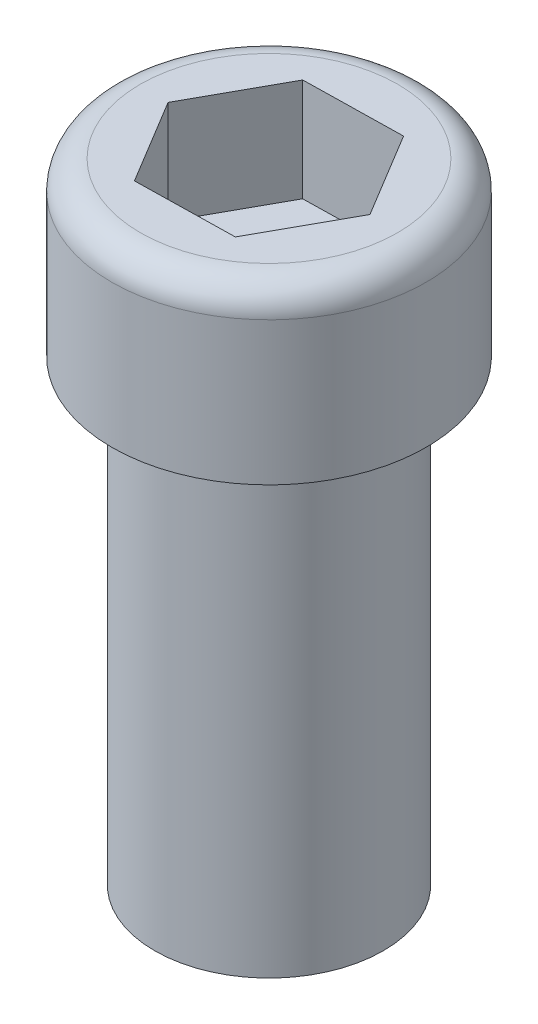
ISO-10303-21;
HEADER;
FILE_DESCRIPTION(('STEP AP214'),'2;1');
FILE_NAME('part.step','',(''),(''),'','','');
FILE_SCHEMA(('AUTOMOTIVE_DESIGN { 1 0 10303 214 1 1 1 1 }'));
ENDSEC;
DATA;
#1=APPLICATION_CONTEXT('core data for automotive mechanical design processes');
#2=APPLICATION_PROTOCOL_DEFINITION('international standard','automotive_design',2000,#1);
#3=PRODUCT_CONTEXT('',#1,'mechanical');
#4=PRODUCT('Part','Part','',(#3));
#5=PRODUCT_RELATED_PRODUCT_CATEGORY('part','',(#4));
#6=PRODUCT_DEFINITION_FORMATION('','',#4);
#7=PRODUCT_DEFINITION_CONTEXT('part definition',#1,'design');
#8=PRODUCT_DEFINITION('design','',#6,#7);
#9=PRODUCT_DEFINITION_SHAPE('','',#8);
#10=(LENGTH_UNIT() NAMED_UNIT(*) SI_UNIT(.MILLI.,.METRE.));
#11=(NAMED_UNIT(*) PLANE_ANGLE_UNIT() SI_UNIT($,.RADIAN.));
#12=(NAMED_UNIT(*) SI_UNIT($,.STERADIAN.) SOLID_ANGLE_UNIT());
#13=UNCERTAINTY_MEASURE_WITH_UNIT(LENGTH_MEASURE(1.E-05),#10,'distance_accuracy_value','');
#14=(GEOMETRIC_REPRESENTATION_CONTEXT(3) GLOBAL_UNCERTAINTY_ASSIGNED_CONTEXT((#13)) GLOBAL_UNIT_ASSIGNED_CONTEXT((#10,
#11,#12)) REPRESENTATION_CONTEXT('',''));
#15=CARTESIAN_POINT('',(0.,0.,0.));
#16=DIRECTION('',(0.,0.,1.));
#17=DIRECTION('',(1.,0.,0.));
#18=AXIS2_PLACEMENT_3D('',#15,#16,#17);
#19=CARTESIAN_POINT('',(0.,8.,0.));
#20=DIRECTION('',(0.,-1.,0.));
#21=DIRECTION('',(0.,0.,-1.));
#22=AXIS2_PLACEMENT_3D('',#19,#20,#21);
#23=CYLINDRICAL_SURFACE('',#22,2.);
#24=CARTESIAN_POINT('',(0.,8.,0.));
#25=DIRECTION('',(0.,1.,0.));
#26=DIRECTION('',(0.,0.,1.));
#27=AXIS2_PLACEMENT_3D('',#24,#25,#26);
#28=CIRCLE('',#27,2.);
#29=CARTESIAN_POINT('',(0.,8.,2.));
#30=VERTEX_POINT('',#29);
#31=EDGE_CURVE('E144',#30,#30,#28,.T.);
#32=ORIENTED_EDGE('',*,*,#31,.F.);
#33=EDGE_LOOP('',(#32));
#34=FACE_BOUND('',#33,.T.);
#35=CARTESIAN_POINT('',(0.,0.,0.));
#36=DIRECTION('',(0.,1.,0.));
#37=DIRECTION('',(0.,0.,1.));
#38=AXIS2_PLACEMENT_3D('',#35,#36,#37);
#39=CIRCLE('',#38,2.);
#40=CARTESIAN_POINT('',(0.,0.,2.));
#41=VERTEX_POINT('',#40);
#42=EDGE_CURVE('E143',#41,#41,#39,.T.);
#43=ORIENTED_EDGE('',*,*,#42,.T.);
#44=EDGE_LOOP('',(#43));
#45=FACE_BOUND('',#44,.T.);
#46=ADVANCED_FACE('F33',(#34,#45),#23,.T.);
#47=CARTESIAN_POINT('',(0.,0.,0.));
#48=DIRECTION('',(0.,1.,0.));
#49=DIRECTION('',(0.,0.,1.));
#50=AXIS2_PLACEMENT_3D('',#47,#48,#49);
#51=PLANE('',#50);
#52=ORIENTED_EDGE('',*,*,#42,.F.);
#53=EDGE_LOOP('',(#52));
#54=FACE_BOUND('',#53,.T.);
#55=ADVANCED_FACE('F163',(#54),#51,.F.);
#56=CARTESIAN_POINT('',(0.,11.,0.));
#57=DIRECTION('',(0.,-1.,0.));
#58=DIRECTION('',(0.,0.,-1.));
#59=AXIS2_PLACEMENT_3D('',#56,#57,#58);
#60=CYLINDRICAL_SURFACE('',#59,2.75);
#61=CARTESIAN_POINT('',(0.,10.5,0.));
#62=DIRECTION('',(0.,1.,0.));
#63=DIRECTION('',(0.,0.,1.));
#64=AXIS2_PLACEMENT_3D('',#61,#62,#63);
#65=CIRCLE('',#64,2.75);
#66=CARTESIAN_POINT('',(0.,10.5,2.75));
#67=VERTEX_POINT('',#66);
#68=EDGE_CURVE('E11',#67,#67,#65,.F.);
#69=ORIENTED_EDGE('',*,*,#68,.T.);
#70=EDGE_LOOP('',(#69));
#71=FACE_BOUND('',#70,.T.);
#72=CARTESIAN_POINT('',(0.,8.,0.));
#73=DIRECTION('',(0.,1.,0.));
#74=DIRECTION('',(0.,0.,1.));
#75=AXIS2_PLACEMENT_3D('',#72,#73,#74);
#76=CIRCLE('',#75,2.75);
#77=CARTESIAN_POINT('',(0.,8.,2.75));
#78=VERTEX_POINT('',#77);
#79=EDGE_CURVE('E135',#78,#78,#76,.T.);
#80=ORIENTED_EDGE('',*,*,#79,.T.);
#81=EDGE_LOOP('',(#80));
#82=FACE_BOUND('',#81,.T.);
#83=ADVANCED_FACE('F168',(#71,#82),#60,.T.);
#84=CARTESIAN_POINT('',(0.,11.,0.));
#85=DIRECTION('',(0.,1.,0.));
#86=DIRECTION('',(0.,0.,1.));
#87=AXIS2_PLACEMENT_3D('',#84,#85,#86);
#88=PLANE('',#87);
#89=CARTESIAN_POINT('',(0.,11.,0.));
#90=DIRECTION('',(0.,1.,0.));
#91=DIRECTION('',(0.,0.,1.));
#92=AXIS2_PLACEMENT_3D('',#89,#90,#91);
#93=CIRCLE('',#92,2.25);
#94=CARTESIAN_POINT('',(0.,11.,2.25));
#95=VERTEX_POINT('',#94);
#96=EDGE_CURVE('E41',#95,#95,#93,.T.);
#97=ORIENTED_EDGE('',*,*,#96,.T.);
#98=EDGE_LOOP('',(#97));
#99=FACE_BOUND('',#98,.T.);
#100=DIRECTION('',(-0.516429053512863,0.,-0.85632997885617));
#101=VECTOR('',#100,1.);
#102=CARTESIAN_POINT('',(1.73173564787874,11.,-0.0330400645576599));
#103=LINE('',#102,#101);
#104=CARTESIAN_POINT('',(1.73173564787874,11.,-0.0330400645576599));
#105=VERTEX_POINT('',#104);
#106=CARTESIAN_POINT('',(0.837254288689758,11.,-1.51624709598092));
#107=VERTEX_POINT('',#106);
#108=EDGE_CURVE('E48',#105,#107,#103,.T.);
#109=ORIENTED_EDGE('',*,*,#108,.F.);
#110=DIRECTION('',(0.483388988955203,0.,-0.875405669022578));
#111=VECTOR('',#110,1.);
#112=CARTESIAN_POINT('',(0.894481359188981,11.,1.48320703142326));
#113=LINE('',#112,#111);
#114=CARTESIAN_POINT('',(0.894481359188981,11.,1.48320703142326));
#115=VERTEX_POINT('',#114);
#116=EDGE_CURVE('E131',#115,#105,#113,.T.);
#117=ORIENTED_EDGE('',*,*,#116,.F.);
#118=DIRECTION('',(0.999818042468066,0.,-0.0190756901664078));
#119=VECTOR('',#118,1.);
#120=CARTESIAN_POINT('',(-0.837254288689758,11.,1.51624709598092));
#121=LINE('',#120,#119);
#122=CARTESIAN_POINT('',(-0.837254288689758,11.,1.51624709598092));
#123=VERTEX_POINT('',#122);
#124=EDGE_CURVE('E129',#123,#115,#121,.T.);
#125=ORIENTED_EDGE('',*,*,#124,.F.);
#126=DIRECTION('',(0.516429053512863,0.,0.85632997885617));
#127=VECTOR('',#126,1.);
#128=CARTESIAN_POINT('',(-1.73173564787874,11.,0.0330400645576596));
#129=LINE('',#128,#127);
#130=CARTESIAN_POINT('',(-1.73173564787874,11.,0.0330400645576596));
#131=VERTEX_POINT('',#130);
#132=EDGE_CURVE('E96',#131,#123,#129,.T.);
#133=ORIENTED_EDGE('',*,*,#132,.F.);
#134=DIRECTION('',(-0.483388988955203,0.,0.875405669022578));
#135=VECTOR('',#134,1.);
#136=CARTESIAN_POINT('',(-0.894481359188981,11.,-1.48320703142326));
#137=LINE('',#136,#135);
#138=CARTESIAN_POINT('',(-0.894481359188981,11.,-1.48320703142326));
#139=VERTEX_POINT('',#138);
#140=EDGE_CURVE('E125',#139,#131,#137,.T.);
#141=ORIENTED_EDGE('',*,*,#140,.F.);
#142=DIRECTION('',(-0.999818042468066,0.,0.0190756901664077));
#143=VECTOR('',#142,1.);
#144=CARTESIAN_POINT('',(0.837254288689758,11.,-1.51624709598092));
#145=LINE('',#144,#143);
#146=EDGE_CURVE('E122',#107,#139,#145,.T.);
#147=ORIENTED_EDGE('',*,*,#146,.F.);
#148=EDGE_LOOP('',(#109,#117,#125,#133,#141,#147));
#149=FACE_BOUND('',#148,.T.);
#150=ADVANCED_FACE('F151',(#99,#149),#88,.T.);
#151=CARTESIAN_POINT('',(0.,8.,0.));
#152=DIRECTION('',(0.,1.,0.));
#153=DIRECTION('',(0.,0.,1.));
#154=AXIS2_PLACEMENT_3D('',#151,#152,#153);
#155=PLANE('',#154);
#156=ORIENTED_EDGE('',*,*,#31,.T.);
#157=EDGE_LOOP('',(#156));
#158=FACE_BOUND('',#157,.T.);
#159=ORIENTED_EDGE('',*,*,#79,.F.);
#160=EDGE_LOOP('',(#159));
#161=FACE_BOUND('',#160,.T.);
#162=ADVANCED_FACE('F177',(#158,#161),#155,.F.);
#163=CARTESIAN_POINT('',(1.73173564787874,9.2,-0.0330400645576599));
#164=DIRECTION('',(0.85632997885617,0.,-0.516429053512863));
#165=DIRECTION('',(-0.516429053512863,0.,-0.85632997885617));
#166=AXIS2_PLACEMENT_3D('',#163,#164,#165);
#167=PLANE('',#166);
#168=ORIENTED_EDGE('',*,*,#108,.T.);
#169=DIRECTION('',(0.,1.,0.));
#170=VECTOR('',#169,1.);
#171=CARTESIAN_POINT('',(0.837254288689758,9.2,-1.51624709598092));
#172=LINE('',#171,#170);
#173=CARTESIAN_POINT('',(0.837254288689758,9.2,-1.51624709598092));
#174=VERTEX_POINT('',#173);
#175=EDGE_CURVE('E78',#174,#107,#172,.T.);
#176=ORIENTED_EDGE('',*,*,#175,.F.);
#177=DIRECTION('',(-0.516429053512863,0.,-0.85632997885617));
#178=VECTOR('',#177,1.);
#179=CARTESIAN_POINT('',(1.73173564787874,9.2,-0.0330400645576599));
#180=LINE('',#179,#178);
#181=CARTESIAN_POINT('',(1.73173564787874,9.2,-0.0330400645576599));
#182=VERTEX_POINT('',#181);
#183=EDGE_CURVE('E133',#182,#174,#180,.T.);
#184=ORIENTED_EDGE('',*,*,#183,.F.);
#185=DIRECTION('',(0.,1.,0.));
#186=VECTOR('',#185,1.);
#187=CARTESIAN_POINT('',(1.73173564787874,9.2,-0.0330400645576599));
#188=LINE('',#187,#186);
#189=EDGE_CURVE('E56',#182,#105,#188,.T.);
#190=ORIENTED_EDGE('',*,*,#189,.T.);
#191=EDGE_LOOP('',(#168,#176,#184,#190));
#192=FACE_BOUND('',#191,.T.);
#193=ADVANCED_FACE('F180',(#192),#167,.F.);
#194=CARTESIAN_POINT('',(0.894481359188981,9.2,1.48320703142326));
#195=DIRECTION('',(0.875405669022578,0.,0.483388988955203));
#196=DIRECTION('',(0.483388988955203,0.,-0.875405669022578));
#197=AXIS2_PLACEMENT_3D('',#194,#195,#196);
#198=PLANE('',#197);
#199=ORIENTED_EDGE('',*,*,#116,.T.);
#200=ORIENTED_EDGE('',*,*,#189,.F.);
#201=DIRECTION('',(0.483388988955203,0.,-0.875405669022578));
#202=VECTOR('',#201,1.);
#203=CARTESIAN_POINT('',(0.894481359188981,9.2,1.48320703142326));
#204=LINE('',#203,#202);
#205=CARTESIAN_POINT('',(0.894481359188981,9.2,1.48320703142326));
#206=VERTEX_POINT('',#205);
#207=EDGE_CURVE('E108',#206,#182,#204,.T.);
#208=ORIENTED_EDGE('',*,*,#207,.F.);
#209=DIRECTION('',(0.,1.,0.));
#210=VECTOR('',#209,1.);
#211=CARTESIAN_POINT('',(0.894481359188981,9.2,1.48320703142326));
#212=LINE('',#211,#210);
#213=EDGE_CURVE('E100',#206,#115,#212,.T.);
#214=ORIENTED_EDGE('',*,*,#213,.T.);
#215=EDGE_LOOP('',(#199,#200,#208,#214));
#216=FACE_BOUND('',#215,.T.);
#217=ADVANCED_FACE('F186',(#216),#198,.F.);
#218=CARTESIAN_POINT('',(-0.837254288689758,9.2,1.51624709598092));
#219=DIRECTION('',(0.0190756901664078,0.,0.999818042468066));
#220=DIRECTION('',(0.999818042468066,0.,-0.0190756901664078));
#221=AXIS2_PLACEMENT_3D('',#218,#219,#220);
#222=PLANE('',#221);
#223=ORIENTED_EDGE('',*,*,#124,.T.);
#224=ORIENTED_EDGE('',*,*,#213,.F.);
#225=DIRECTION('',(0.999818042468066,0.,-0.0190756901664078));
#226=VECTOR('',#225,1.);
#227=CARTESIAN_POINT('',(-0.837254288689758,9.2,1.51624709598092));
#228=LINE('',#227,#226);
#229=CARTESIAN_POINT('',(-0.837254288689758,9.2,1.51624709598092));
#230=VERTEX_POINT('',#229);
#231=EDGE_CURVE('E104',#230,#206,#228,.T.);
#232=ORIENTED_EDGE('',*,*,#231,.F.);
#233=DIRECTION('',(0.,1.,0.));
#234=VECTOR('',#233,1.);
#235=CARTESIAN_POINT('',(-0.837254288689758,9.2,1.51624709598092));
#236=LINE('',#235,#234);
#237=EDGE_CURVE('E89',#230,#123,#236,.T.);
#238=ORIENTED_EDGE('',*,*,#237,.T.);
#239=EDGE_LOOP('',(#223,#224,#232,#238));
#240=FACE_BOUND('',#239,.T.);
#241=ADVANCED_FACE('F105',(#240),#222,.F.);
#242=CARTESIAN_POINT('',(-1.73173564787874,9.2,0.0330400645576596));
#243=DIRECTION('',(-0.85632997885617,0.,0.516429053512863));
#244=DIRECTION('',(0.516429053512863,0.,0.85632997885617));
#245=AXIS2_PLACEMENT_3D('',#242,#243,#244);
#246=PLANE('',#245);
#247=ORIENTED_EDGE('',*,*,#132,.T.);
#248=ORIENTED_EDGE('',*,*,#237,.F.);
#249=DIRECTION('',(0.516429053512863,0.,0.85632997885617));
#250=VECTOR('',#249,1.);
#251=CARTESIAN_POINT('',(-1.73173564787874,9.2,0.0330400645576596));
#252=LINE('',#251,#250);
#253=CARTESIAN_POINT('',(-1.73173564787874,9.2,0.0330400645576596));
#254=VERTEX_POINT('',#253);
#255=EDGE_CURVE('E93',#254,#230,#252,.T.);
#256=ORIENTED_EDGE('',*,*,#255,.F.);
#257=DIRECTION('',(0.,1.,0.));
#258=VECTOR('',#257,1.);
#259=CARTESIAN_POINT('',(-1.73173564787874,9.2,0.0330400645576596));
#260=LINE('',#259,#258);
#261=EDGE_CURVE('E101',#254,#131,#260,.T.);
#262=ORIENTED_EDGE('',*,*,#261,.T.);
#263=EDGE_LOOP('',(#247,#248,#256,#262));
#264=FACE_BOUND('',#263,.T.);
#265=ADVANCED_FACE('F91',(#264),#246,.F.);
#266=CARTESIAN_POINT('',(-0.894481359188981,9.2,-1.48320703142326));
#267=DIRECTION('',(-0.875405669022578,0.,-0.483388988955203));
#268=DIRECTION('',(-0.483388988955203,0.,0.875405669022578));
#269=AXIS2_PLACEMENT_3D('',#266,#267,#268);
#270=PLANE('',#269);
#271=ORIENTED_EDGE('',*,*,#140,.T.);
#272=ORIENTED_EDGE('',*,*,#261,.F.);
#273=DIRECTION('',(-0.483388988955203,0.,0.875405669022578));
#274=VECTOR('',#273,1.);
#275=CARTESIAN_POINT('',(-0.894481359188981,9.2,-1.48320703142326));
#276=LINE('',#275,#274);
#277=CARTESIAN_POINT('',(-0.894481359188981,9.2,-1.48320703142326));
#278=VERTEX_POINT('',#277);
#279=EDGE_CURVE('E114',#278,#254,#276,.T.);
#280=ORIENTED_EDGE('',*,*,#279,.F.);
#281=DIRECTION('',(0.,1.,0.));
#282=VECTOR('',#281,1.);
#283=CARTESIAN_POINT('',(-0.894481359188981,9.2,-1.48320703142326));
#284=LINE('',#283,#282);
#285=EDGE_CURVE('E138',#278,#139,#284,.T.);
#286=ORIENTED_EDGE('',*,*,#285,.T.);
#287=EDGE_LOOP('',(#271,#272,#280,#286));
#288=FACE_BOUND('',#287,.T.);
#289=ADVANCED_FACE('F189',(#288),#270,.F.);
#290=CARTESIAN_POINT('',(0.837254288689758,9.2,-1.51624709598092));
#291=DIRECTION('',(-0.0190756901664077,0.,-0.999818042468066));
#292=DIRECTION('',(-0.999818042468066,0.,0.0190756901664077));
#293=AXIS2_PLACEMENT_3D('',#290,#291,#292);
#294=PLANE('',#293);
#295=ORIENTED_EDGE('',*,*,#146,.T.);
#296=ORIENTED_EDGE('',*,*,#285,.F.);
#297=DIRECTION('',(-0.999818042468066,0.,0.0190756901664077));
#298=VECTOR('',#297,1.);
#299=CARTESIAN_POINT('',(0.837254288689758,9.2,-1.51624709598092));
#300=LINE('',#299,#298);
#301=EDGE_CURVE('E116',#174,#278,#300,.T.);
#302=ORIENTED_EDGE('',*,*,#301,.F.);
#303=ORIENTED_EDGE('',*,*,#175,.T.);
#304=EDGE_LOOP('',(#295,#296,#302,#303));
#305=FACE_BOUND('',#304,.T.);
#306=ADVANCED_FACE('F159',(#305),#294,.F.);
#307=CARTESIAN_POINT('',(0.,9.2,0.));
#308=DIRECTION('',(0.,1.,0.));
#309=DIRECTION('',(0.,0.,1.));
#310=AXIS2_PLACEMENT_3D('',#307,#308,#309);
#311=PLANE('',#310);
#312=ORIENTED_EDGE('',*,*,#183,.T.);
#313=ORIENTED_EDGE('',*,*,#301,.T.);
#314=ORIENTED_EDGE('',*,*,#279,.T.);
#315=ORIENTED_EDGE('',*,*,#255,.T.);
#316=ORIENTED_EDGE('',*,*,#231,.T.);
#317=ORIENTED_EDGE('',*,*,#207,.T.);
#318=EDGE_LOOP('',(#312,#313,#314,#315,#316,#317));
#319=FACE_BOUND('',#318,.T.);
#320=ADVANCED_FACE('F111',(#319),#311,.T.);
#321=CARTESIAN_POINT('',(0.,10.5,0.));
#322=DIRECTION('',(0.,1.,0.));
#323=DIRECTION('',(0.,0.,1.));
#324=AXIS2_PLACEMENT_3D('',#321,#322,#323);
#325=TOROIDAL_SURFACE('',#324,2.25,0.5);
#326=ORIENTED_EDGE('',*,*,#68,.F.);
#327=EDGE_LOOP('',(#326));
#328=FACE_BOUND('',#327,.T.);
#329=ORIENTED_EDGE('',*,*,#96,.F.);
#330=EDGE_LOOP('',(#329));
#331=FACE_BOUND('',#330,.T.);
#332=ADVANCED_FACE('F35',(#328,#331),#325,.T.);
#333=CLOSED_SHELL('',(#46,#55,#83,#150,#162,#193,#217,#241,#265,#289,#306,#320,#332));
#334=MANIFOLD_SOLID_BREP('B2',#333);
#335=ADVANCED_BREP_SHAPE_REPRESENTATION('',(#18,#334),#14);
#336=SHAPE_DEFINITION_REPRESENTATION(#9,#335);
ENDSEC;
END-ISO-10303-21;
